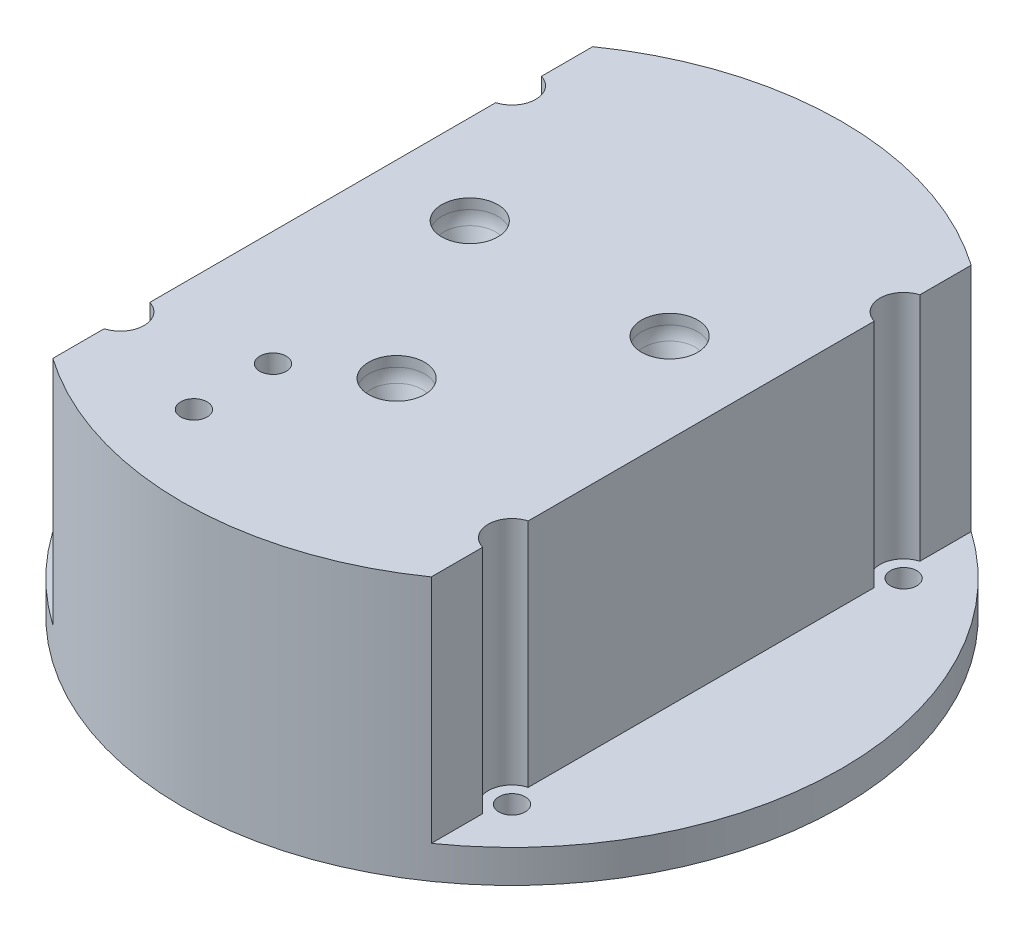
ISO-10303-21;
HEADER;
FILE_DESCRIPTION(('STEP AP214'),'2;1');
FILE_NAME('part.step','',(''),(''),'','','');
FILE_SCHEMA(('AUTOMOTIVE_DESIGN { 1 0 10303 214 1 1 1 1 }'));
ENDSEC;
DATA;
#1=APPLICATION_CONTEXT('core data for automotive mechanical design processes');
#2=APPLICATION_PROTOCOL_DEFINITION('international standard','automotive_design',2000,#1);
#3=PRODUCT_CONTEXT('',#1,'mechanical');
#4=PRODUCT('Part','Part','',(#3));
#5=PRODUCT_RELATED_PRODUCT_CATEGORY('part','',(#4));
#6=PRODUCT_DEFINITION_FORMATION('','',#4);
#7=PRODUCT_DEFINITION_CONTEXT('part definition',#1,'design');
#8=PRODUCT_DEFINITION('design','',#6,#7);
#9=PRODUCT_DEFINITION_SHAPE('','',#8);
#10=(LENGTH_UNIT() NAMED_UNIT(*) SI_UNIT(.MILLI.,.METRE.));
#11=(NAMED_UNIT(*) PLANE_ANGLE_UNIT() SI_UNIT($,.RADIAN.));
#12=(NAMED_UNIT(*) SI_UNIT($,.STERADIAN.) SOLID_ANGLE_UNIT());
#13=UNCERTAINTY_MEASURE_WITH_UNIT(LENGTH_MEASURE(1.E-05),#10,'distance_accuracy_value','');
#14=(GEOMETRIC_REPRESENTATION_CONTEXT(3) GLOBAL_UNCERTAINTY_ASSIGNED_CONTEXT((#13)) GLOBAL_UNIT_ASSIGNED_CONTEXT((#10,
#11,#12)) REPRESENTATION_CONTEXT('',''));
#15=CARTESIAN_POINT('',(0.,0.,0.));
#16=DIRECTION('',(0.,0.,1.));
#17=DIRECTION('',(1.,0.,0.));
#18=AXIS2_PLACEMENT_3D('',#15,#16,#17);
#19=CARTESIAN_POINT('',(-28.7,40.,0.));
#20=DIRECTION('',(1.,0.,0.));
#21=DIRECTION('',(0.,0.,-1.));
#22=AXIS2_PLACEMENT_3D('',#19,#20,#21);
#23=PLANE('',#22);
#24=DIRECTION('',(0.,-1.,0.));
#25=VECTOR('',#24,1.);
#26=CARTESIAN_POINT('',(-28.7,40.,-26.2397237477598));
#27=LINE('',#26,#25);
#28=CARTESIAN_POINT('',(-28.7,5.,-26.2397237477598));
#29=VERTEX_POINT('',#28);
#30=CARTESIAN_POINT('',(-28.7,40.,-26.2397237477598));
#31=VERTEX_POINT('',#30);
#32=EDGE_CURVE('E137',#29,#31,#27,.F.);
#33=ORIENTED_EDGE('',*,*,#32,.F.);
#34=DIRECTION('',(0.,0.,-1.));
#35=VECTOR('',#34,1.);
#36=CARTESIAN_POINT('',(-28.7,5.,0.));
#37=LINE('',#36,#35);
#38=CARTESIAN_POINT('',(-28.7,5.,26.2397237477595));
#39=VERTEX_POINT('',#38);
#40=EDGE_CURVE('E149',#39,#29,#37,.T.);
#41=ORIENTED_EDGE('',*,*,#40,.F.);
#42=DIRECTION('',(0.,-1.,0.));
#43=VECTOR('',#42,1.);
#44=CARTESIAN_POINT('',(-28.7,40.,26.2397237477595));
#45=LINE('',#44,#43);
#46=CARTESIAN_POINT('',(-28.7,40.,26.2397237477595));
#47=VERTEX_POINT('',#46);
#48=EDGE_CURVE('E232',#47,#39,#45,.T.);
#49=ORIENTED_EDGE('',*,*,#48,.F.);
#50=DIRECTION('',(0.,0.,1.));
#51=VECTOR('',#50,1.);
#52=CARTESIAN_POINT('',(-28.7,40.,0.));
#53=LINE('',#52,#51);
#54=EDGE_CURVE('E151',#31,#47,#53,.T.);
#55=ORIENTED_EDGE('',*,*,#54,.F.);
#56=EDGE_LOOP('',(#33,#41,#49,#55));
#57=FACE_BOUND('',#56,.T.);
#58=ADVANCED_FACE('F47',(#57),#23,.F.);
#59=DIRECTION('',(0.,-1.,0.));
#60=VECTOR('',#59,1.);
#61=CARTESIAN_POINT('',(-28.7,40.,33.1572458719102));
#62=LINE('',#61,#60);
#63=CARTESIAN_POINT('',(-28.7,5.,33.1572458719102));
#64=VERTEX_POINT('',#63);
#65=CARTESIAN_POINT('',(-28.7,40.,33.1572458719102));
#66=VERTEX_POINT('',#65);
#67=EDGE_CURVE('E301',#64,#66,#62,.F.);
#68=ORIENTED_EDGE('',*,*,#67,.F.);
#69=CARTESIAN_POINT('',(-28.7,5.,40.9427649286171));
#70=VERTEX_POINT('',#69);
#71=EDGE_CURVE('E158',#70,#64,#37,.T.);
#72=ORIENTED_EDGE('',*,*,#71,.F.);
#73=DIRECTION('',(0.,-1.,0.));
#74=VECTOR('',#73,1.);
#75=CARTESIAN_POINT('',(-28.7,40.,40.9427649286171));
#76=LINE('',#75,#74);
#77=CARTESIAN_POINT('',(-28.7,40.,40.9427649286171));
#78=VERTEX_POINT('',#77);
#79=EDGE_CURVE('E415',#78,#70,#76,.T.);
#80=ORIENTED_EDGE('',*,*,#79,.F.);
#81=EDGE_CURVE('E244',#66,#78,#53,.T.);
#82=ORIENTED_EDGE('',*,*,#81,.F.);
#83=EDGE_LOOP('',(#68,#72,#80,#82));
#84=FACE_BOUND('',#83,.T.);
#85=ADVANCED_FACE('F206',(#84),#23,.F.);
#86=CARTESIAN_POINT('',(28.7,40.,0.));
#87=DIRECTION('',(1.,0.,0.));
#88=DIRECTION('',(0.,0.,-1.));
#89=AXIS2_PLACEMENT_3D('',#86,#87,#88);
#90=PLANE('',#89);
#91=DIRECTION('',(0.,0.,-1.));
#92=VECTOR('',#91,1.);
#93=CARTESIAN_POINT('',(28.7,5.,0.));
#94=LINE('',#93,#92);
#95=CARTESIAN_POINT('',(28.7,5.,40.9427649286171));
#96=VERTEX_POINT('',#95);
#97=CARTESIAN_POINT('',(28.7,5.,33.1572458719104));
#98=VERTEX_POINT('',#97);
#99=EDGE_CURVE('E161',#96,#98,#94,.T.);
#100=ORIENTED_EDGE('',*,*,#99,.T.);
#101=DIRECTION('',(0.,-1.,0.));
#102=VECTOR('',#101,1.);
#103=CARTESIAN_POINT('',(28.7,40.,33.1572458719104));
#104=LINE('',#103,#102);
#105=CARTESIAN_POINT('',(28.7,40.,33.1572458719104));
#106=VERTEX_POINT('',#105);
#107=EDGE_CURVE('E303',#98,#106,#104,.F.);
#108=ORIENTED_EDGE('',*,*,#107,.T.);
#109=DIRECTION('',(0.,0.,1.));
#110=VECTOR('',#109,1.);
#111=CARTESIAN_POINT('',(28.7,40.,0.));
#112=LINE('',#111,#110);
#113=CARTESIAN_POINT('',(28.7,40.,40.9427649286171));
#114=VERTEX_POINT('',#113);
#115=EDGE_CURVE('E246',#106,#114,#112,.T.);
#116=ORIENTED_EDGE('',*,*,#115,.T.);
#117=DIRECTION('',(0.,-1.,0.));
#118=VECTOR('',#117,1.);
#119=CARTESIAN_POINT('',(28.7,40.,40.9427649286171));
#120=LINE('',#119,#118);
#121=EDGE_CURVE('E407',#114,#96,#120,.T.);
#122=ORIENTED_EDGE('',*,*,#121,.T.);
#123=EDGE_LOOP('',(#100,#108,#116,#122));
#124=FACE_BOUND('',#123,.T.);
#125=ADVANCED_FACE('F213',(#124),#90,.T.);
#126=CARTESIAN_POINT('',(28.7,5.,26.2397237477596));
#127=VERTEX_POINT('',#126);
#128=CARTESIAN_POINT('',(28.7,5.,-26.2397237477594));
#129=VERTEX_POINT('',#128);
#130=EDGE_CURVE('E410',#127,#129,#94,.T.);
#131=ORIENTED_EDGE('',*,*,#130,.T.);
#132=DIRECTION('',(0.,-1.,0.));
#133=VECTOR('',#132,1.);
#134=CARTESIAN_POINT('',(28.7,40.,-26.2397237477594));
#135=LINE('',#134,#133);
#136=CARTESIAN_POINT('',(28.7,40.,-26.2397237477594));
#137=VERTEX_POINT('',#136);
#138=EDGE_CURVE('E276',#129,#137,#135,.F.);
#139=ORIENTED_EDGE('',*,*,#138,.T.);
#140=CARTESIAN_POINT('',(28.7,40.,26.2397237477596));
#141=VERTEX_POINT('',#140);
#142=EDGE_CURVE('E424',#137,#141,#112,.T.);
#143=ORIENTED_EDGE('',*,*,#142,.T.);
#144=DIRECTION('',(0.,-1.,0.));
#145=VECTOR('',#144,1.);
#146=CARTESIAN_POINT('',(28.7,40.,26.2397237477596));
#147=LINE('',#146,#145);
#148=EDGE_CURVE('E306',#141,#127,#147,.T.);
#149=ORIENTED_EDGE('',*,*,#148,.T.);
#150=EDGE_LOOP('',(#131,#139,#143,#149));
#151=FACE_BOUND('',#150,.T.);
#152=ADVANCED_FACE('F219',(#151),#90,.T.);
#153=DIRECTION('',(0.,-1.,0.));
#154=VECTOR('',#153,1.);
#155=CARTESIAN_POINT('',(-28.7,40.,-33.1572458719106));
#156=LINE('',#155,#154);
#157=CARTESIAN_POINT('',(-28.7,40.,-33.1572458719106));
#158=VERTEX_POINT('',#157);
#159=CARTESIAN_POINT('',(-28.7,5.,-33.1572458719106));
#160=VERTEX_POINT('',#159);
#161=EDGE_CURVE('E140',#158,#160,#156,.T.);
#162=ORIENTED_EDGE('',*,*,#161,.F.);
#163=CARTESIAN_POINT('',(-28.7,40.,-40.9427649286171));
#164=VERTEX_POINT('',#163);
#165=EDGE_CURVE('E230',#164,#158,#53,.T.);
#166=ORIENTED_EDGE('',*,*,#165,.F.);
#167=DIRECTION('',(0.,-1.,0.));
#168=VECTOR('',#167,1.);
#169=CARTESIAN_POINT('',(-28.7,40.,-40.9427649286171));
#170=LINE('',#169,#168);
#171=CARTESIAN_POINT('',(-28.7,5.,-40.9427649286171));
#172=VERTEX_POINT('',#171);
#173=EDGE_CURVE('E413',#164,#172,#170,.T.);
#174=ORIENTED_EDGE('',*,*,#173,.T.);
#175=EDGE_CURVE('E67',#160,#172,#37,.T.);
#176=ORIENTED_EDGE('',*,*,#175,.F.);
#177=EDGE_LOOP('',(#162,#166,#174,#176));
#178=FACE_BOUND('',#177,.T.);
#179=ADVANCED_FACE('F208',(#178),#23,.F.);
#180=CARTESIAN_POINT('',(28.7,40.,-40.9427649286171));
#181=VERTEX_POINT('',#180);
#182=CARTESIAN_POINT('',(28.7,40.,-33.15724587191));
#183=VERTEX_POINT('',#182);
#184=EDGE_CURVE('E422',#181,#183,#112,.T.);
#185=ORIENTED_EDGE('',*,*,#184,.T.);
#186=DIRECTION('',(0.,-1.,0.));
#187=VECTOR('',#186,1.);
#188=CARTESIAN_POINT('',(28.7,40.,-33.15724587191));
#189=LINE('',#188,#187);
#190=CARTESIAN_POINT('',(28.7,5.,-33.15724587191));
#191=VERTEX_POINT('',#190);
#192=EDGE_CURVE('E152',#183,#191,#189,.T.);
#193=ORIENTED_EDGE('',*,*,#192,.T.);
#194=CARTESIAN_POINT('',(28.7,5.,-40.9427649286171));
#195=VERTEX_POINT('',#194);
#196=EDGE_CURVE('E411',#191,#195,#94,.T.);
#197=ORIENTED_EDGE('',*,*,#196,.T.);
#198=DIRECTION('',(0.,-1.,0.));
#199=VECTOR('',#198,1.);
#200=CARTESIAN_POINT('',(28.7,40.,-40.9427649286171));
#201=LINE('',#200,#199);
#202=EDGE_CURVE('E420',#181,#195,#201,.T.);
#203=ORIENTED_EDGE('',*,*,#202,.F.);
#204=EDGE_LOOP('',(#185,#193,#197,#203));
#205=FACE_BOUND('',#204,.T.);
#206=ADVANCED_FACE('F218',(#205),#90,.T.);
#207=CARTESIAN_POINT('',(29.698484809835,5.,29.698484809835));
#208=DIRECTION('',(0.,-1.,0.));
#209=DIRECTION('',(0.,0.,-1.));
#210=AXIS2_PLACEMENT_3D('',#207,#208,#209);
#211=CYLINDRICAL_SURFACE('',#210,2.00000000000001);
#212=CARTESIAN_POINT('',(29.698484809835,0.,29.698484809835));
#213=DIRECTION('',(0.,-1.,0.));
#214=DIRECTION('',(0.,0.,-1.));
#215=AXIS2_PLACEMENT_3D('',#212,#213,#214);
#216=CIRCLE('',#215,2.00000000000001);
#217=CARTESIAN_POINT('',(29.698484809835,0.,27.698484809835));
#218=VERTEX_POINT('',#217);
#219=EDGE_CURVE('E269',#218,#218,#216,.T.);
#220=ORIENTED_EDGE('',*,*,#219,.T.);
#221=EDGE_LOOP('',(#220));
#222=FACE_BOUND('',#221,.T.);
#223=CARTESIAN_POINT('',(29.698484809835,5.,29.698484809835));
#224=DIRECTION('',(0.,-1.,0.));
#225=DIRECTION('',(0.,0.,-1.));
#226=AXIS2_PLACEMENT_3D('',#223,#224,#225);
#227=CIRCLE('',#226,2.00000000000001);
#228=CARTESIAN_POINT('',(29.698484809835,5.,27.698484809835));
#229=VERTEX_POINT('',#228);
#230=EDGE_CURVE('E291',#229,#229,#227,.T.);
#231=ORIENTED_EDGE('',*,*,#230,.F.);
#232=EDGE_LOOP('',(#231));
#233=FACE_BOUND('',#232,.T.);
#234=ADVANCED_FACE('F225',(#222,#233),#211,.F.);
#235=CARTESIAN_POINT('',(29.698484809835,5.,-29.698484809835));
#236=DIRECTION('',(0.,-1.,0.));
#237=DIRECTION('',(0.,0.,-1.));
#238=AXIS2_PLACEMENT_3D('',#235,#236,#237);
#239=CYLINDRICAL_SURFACE('',#238,2.00000000000001);
#240=CARTESIAN_POINT('',(29.698484809835,0.,-29.698484809835));
#241=DIRECTION('',(0.,-1.,0.));
#242=DIRECTION('',(0.,0.,-1.));
#243=AXIS2_PLACEMENT_3D('',#240,#241,#242);
#244=CIRCLE('',#243,2.00000000000001);
#245=CARTESIAN_POINT('',(29.698484809835,0.,-31.698484809835));
#246=VERTEX_POINT('',#245);
#247=EDGE_CURVE('E288',#246,#246,#244,.T.);
#248=ORIENTED_EDGE('',*,*,#247,.T.);
#249=EDGE_LOOP('',(#248));
#250=FACE_BOUND('',#249,.T.);
#251=CARTESIAN_POINT('',(29.698484809835,5.,-29.698484809835));
#252=DIRECTION('',(0.,-1.,0.));
#253=DIRECTION('',(0.,0.,-1.));
#254=AXIS2_PLACEMENT_3D('',#251,#252,#253);
#255=CIRCLE('',#254,2.00000000000001);
#256=CARTESIAN_POINT('',(29.698484809835,5.,-31.698484809835));
#257=VERTEX_POINT('',#256);
#258=EDGE_CURVE('E285',#257,#257,#255,.T.);
#259=ORIENTED_EDGE('',*,*,#258,.F.);
#260=EDGE_LOOP('',(#259));
#261=FACE_BOUND('',#260,.T.);
#262=ADVANCED_FACE('F373',(#250,#261),#239,.F.);
#263=CARTESIAN_POINT('',(-29.698484809835,5.,29.698484809835));
#264=DIRECTION('',(0.,-1.,0.));
#265=DIRECTION('',(0.,0.,-1.));
#266=AXIS2_PLACEMENT_3D('',#263,#264,#265);
#267=CYLINDRICAL_SURFACE('',#266,2.00000000000001);
#268=CARTESIAN_POINT('',(-29.698484809835,0.,29.698484809835));
#269=DIRECTION('',(0.,-1.,0.));
#270=DIRECTION('',(0.,0.,-1.));
#271=AXIS2_PLACEMENT_3D('',#268,#269,#270);
#272=CIRCLE('',#271,2.00000000000001);
#273=CARTESIAN_POINT('',(-29.698484809835,0.,27.698484809835));
#274=VERTEX_POINT('',#273);
#275=EDGE_CURVE('E266',#274,#274,#272,.T.);
#276=ORIENTED_EDGE('',*,*,#275,.T.);
#277=EDGE_LOOP('',(#276));
#278=FACE_BOUND('',#277,.T.);
#279=CARTESIAN_POINT('',(-29.698484809835,5.,29.698484809835));
#280=DIRECTION('',(0.,-1.,0.));
#281=DIRECTION('',(0.,0.,-1.));
#282=AXIS2_PLACEMENT_3D('',#279,#280,#281);
#283=CIRCLE('',#282,2.00000000000001);
#284=CARTESIAN_POINT('',(-29.698484809835,5.,27.698484809835));
#285=VERTEX_POINT('',#284);
#286=EDGE_CURVE('E261',#285,#285,#283,.T.);
#287=ORIENTED_EDGE('',*,*,#286,.F.);
#288=EDGE_LOOP('',(#287));
#289=FACE_BOUND('',#288,.T.);
#290=ADVANCED_FACE('F377',(#278,#289),#267,.F.);
#291=CARTESIAN_POINT('',(-29.698484809835,5.,-29.698484809835));
#292=DIRECTION('',(0.,-1.,0.));
#293=DIRECTION('',(0.,0.,-1.));
#294=AXIS2_PLACEMENT_3D('',#291,#292,#293);
#295=CYLINDRICAL_SURFACE('',#294,2.00000000000001);
#296=CARTESIAN_POINT('',(-29.698484809835,0.,-29.698484809835));
#297=DIRECTION('',(0.,-1.,0.));
#298=DIRECTION('',(0.,0.,-1.));
#299=AXIS2_PLACEMENT_3D('',#296,#297,#298);
#300=CIRCLE('',#299,2.00000000000001);
#301=CARTESIAN_POINT('',(-29.698484809835,0.,-31.698484809835));
#302=VERTEX_POINT('',#301);
#303=EDGE_CURVE('E282',#302,#302,#300,.T.);
#304=ORIENTED_EDGE('',*,*,#303,.T.);
#305=EDGE_LOOP('',(#304));
#306=FACE_BOUND('',#305,.T.);
#307=CARTESIAN_POINT('',(-29.698484809835,5.,-29.698484809835));
#308=DIRECTION('',(0.,-1.,0.));
#309=DIRECTION('',(0.,0.,-1.));
#310=AXIS2_PLACEMENT_3D('',#307,#308,#309);
#311=CIRCLE('',#310,2.00000000000001);
#312=CARTESIAN_POINT('',(-29.698484809835,5.,-31.698484809835));
#313=VERTEX_POINT('',#312);
#314=EDGE_CURVE('E279',#313,#313,#311,.T.);
#315=ORIENTED_EDGE('',*,*,#314,.F.);
#316=EDGE_LOOP('',(#315));
#317=FACE_BOUND('',#316,.T.);
#318=ADVANCED_FACE('F379',(#306,#317),#295,.F.);
#319=CARTESIAN_POINT('',(0.,5.,0.));
#320=DIRECTION('',(0.,1.,0.));
#321=DIRECTION('',(0.,0.,1.));
#322=AXIS2_PLACEMENT_3D('',#319,#320,#321);
#323=PLANE('',#322);
#324=ORIENTED_EDGE('',*,*,#40,.T.);
#325=CARTESIAN_POINT('',(-29.6984848098348,5.,-29.6984848098352));
#326=DIRECTION('',(0.,1.,0.));
#327=DIRECTION('',(0.,0.,1.));
#328=AXIS2_PLACEMENT_3D('',#325,#326,#327);
#329=CIRCLE('',#328,3.6);
#330=EDGE_CURVE('E134',#29,#160,#329,.T.);
#331=ORIENTED_EDGE('',*,*,#330,.T.);
#332=ORIENTED_EDGE('',*,*,#175,.T.);
#333=CARTESIAN_POINT('',(0.,5.,0.));
#334=DIRECTION('',(0.,1.,0.));
#335=DIRECTION('',(0.,0.,1.));
#336=AXIS2_PLACEMENT_3D('',#333,#334,#335);
#337=CIRCLE('',#336,50.);
#338=EDGE_CURVE('E62',#172,#70,#337,.T.);
#339=ORIENTED_EDGE('',*,*,#338,.T.);
#340=ORIENTED_EDGE('',*,*,#71,.T.);
#341=CARTESIAN_POINT('',(-29.6984848098351,5.,29.6984848098349));
#342=DIRECTION('',(0.,1.,0.));
#343=DIRECTION('',(0.,0.,1.));
#344=AXIS2_PLACEMENT_3D('',#341,#342,#343);
#345=CIRCLE('',#344,3.60000000000001);
#346=EDGE_CURVE('E157',#64,#39,#345,.T.);
#347=ORIENTED_EDGE('',*,*,#346,.T.);
#348=EDGE_LOOP('',(#324,#331,#332,#339,#340,#347));
#349=FACE_BOUND('',#348,.T.);
#350=ORIENTED_EDGE('',*,*,#314,.T.);
#351=EDGE_LOOP('',(#350));
#352=FACE_BOUND('',#351,.T.);
#353=ORIENTED_EDGE('',*,*,#286,.T.);
#354=EDGE_LOOP('',(#353));
#355=FACE_BOUND('',#354,.T.);
#356=ADVANCED_FACE('F155',(#349,#352,#355),#323,.T.);
#357=CARTESIAN_POINT('',(0.,5.,0.));
#358=DIRECTION('',(0.,-1.,0.));
#359=DIRECTION('',(0.,0.,-1.));
#360=AXIS2_PLACEMENT_3D('',#357,#358,#359);
#361=CYLINDRICAL_SURFACE('',#360,50.);
#362=CARTESIAN_POINT('',(0.,0.,0.));
#363=DIRECTION('',(0.,1.,0.));
#364=DIRECTION('',(0.,0.,1.));
#365=AXIS2_PLACEMENT_3D('',#362,#363,#364);
#366=CIRCLE('',#365,50.);
#367=CARTESIAN_POINT('',(0.,0.,50.));
#368=VERTEX_POINT('',#367);
#369=EDGE_CURVE('E160',#368,#368,#366,.T.);
#370=ORIENTED_EDGE('',*,*,#369,.T.);
#371=EDGE_LOOP('',(#370));
#372=FACE_BOUND('',#371,.T.);
#373=EDGE_CURVE('E165',#96,#195,#337,.T.);
#374=ORIENTED_EDGE('',*,*,#373,.F.);
#375=ORIENTED_EDGE('',*,*,#121,.F.);
#376=CARTESIAN_POINT('',(0.,40.,0.));
#377=DIRECTION('',(0.,1.,0.));
#378=DIRECTION('',(0.,0.,1.));
#379=AXIS2_PLACEMENT_3D('',#376,#377,#378);
#380=CIRCLE('',#379,50.);
#381=EDGE_CURVE('E242',#78,#114,#380,.T.);
#382=ORIENTED_EDGE('',*,*,#381,.F.);
#383=ORIENTED_EDGE('',*,*,#79,.T.);
#384=ORIENTED_EDGE('',*,*,#338,.F.);
#385=ORIENTED_EDGE('',*,*,#173,.F.);
#386=EDGE_CURVE('E240',#181,#164,#380,.T.);
#387=ORIENTED_EDGE('',*,*,#386,.F.);
#388=ORIENTED_EDGE('',*,*,#202,.T.);
#389=EDGE_LOOP('',(#374,#375,#382,#383,#384,#385,#387,#388));
#390=FACE_BOUND('',#389,.T.);
#391=ADVANCED_FACE('F429',(#372,#390),#361,.T.);
#392=CARTESIAN_POINT('',(29.698484809835,5.,29.698484809835));
#393=DIRECTION('',(0.,1.,0.));
#394=DIRECTION('',(0.,0.,1.));
#395=AXIS2_PLACEMENT_3D('',#392,#393,#394);
#396=CIRCLE('',#395,3.6);
#397=EDGE_CURVE('E310',#127,#98,#396,.T.);
#398=ORIENTED_EDGE('',*,*,#397,.T.);
#399=ORIENTED_EDGE('',*,*,#99,.F.);
#400=ORIENTED_EDGE('',*,*,#373,.T.);
#401=ORIENTED_EDGE('',*,*,#196,.F.);
#402=CARTESIAN_POINT('',(29.6984848098353,5.,-29.6984848098347));
#403=DIRECTION('',(0.,1.,0.));
#404=DIRECTION('',(0.,0.,1.));
#405=AXIS2_PLACEMENT_3D('',#402,#403,#404);
#406=CIRCLE('',#405,3.60000000000002);
#407=EDGE_CURVE('E316',#191,#129,#406,.T.);
#408=ORIENTED_EDGE('',*,*,#407,.T.);
#409=ORIENTED_EDGE('',*,*,#130,.F.);
#410=EDGE_LOOP('',(#398,#399,#400,#401,#408,#409));
#411=FACE_BOUND('',#410,.T.);
#412=ORIENTED_EDGE('',*,*,#230,.T.);
#413=EDGE_LOOP('',(#412));
#414=FACE_BOUND('',#413,.T.);
#415=ORIENTED_EDGE('',*,*,#258,.T.);
#416=EDGE_LOOP('',(#415));
#417=FACE_BOUND('',#416,.T.);
#418=ADVANCED_FACE('F430',(#411,#414,#417),#323,.T.);
#419=CARTESIAN_POINT('',(0.,0.,0.));
#420=DIRECTION('',(0.,1.,0.));
#421=DIRECTION('',(0.,0.,1.));
#422=AXIS2_PLACEMENT_3D('',#419,#420,#421);
#423=PLANE('',#422);
#424=CARTESIAN_POINT('',(0.,0.,0.));
#425=DIRECTION('',(0.,-1.,0.));
#426=DIRECTION('',(0.,0.,-1.));
#427=AXIS2_PLACEMENT_3D('',#424,#425,#426);
#428=CIRCLE('',#427,5.05);
#429=CARTESIAN_POINT('',(0.,0.,-5.05));
#430=VERTEX_POINT('',#429);
#431=EDGE_CURVE('E275',#430,#430,#428,.T.);
#432=ORIENTED_EDGE('',*,*,#431,.F.);
#433=EDGE_LOOP('',(#432));
#434=FACE_BOUND('',#433,.T.);
#435=ORIENTED_EDGE('',*,*,#303,.F.);
#436=EDGE_LOOP('',(#435));
#437=FACE_BOUND('',#436,.T.);
#438=ORIENTED_EDGE('',*,*,#247,.F.);
#439=EDGE_LOOP('',(#438));
#440=FACE_BOUND('',#439,.T.);
#441=ORIENTED_EDGE('',*,*,#219,.F.);
#442=EDGE_LOOP('',(#441));
#443=FACE_BOUND('',#442,.T.);
#444=ORIENTED_EDGE('',*,*,#275,.F.);
#445=EDGE_LOOP('',(#444));
#446=FACE_BOUND('',#445,.T.);
#447=CARTESIAN_POINT('',(-11.3,0.,24.9427649286171));
#448=DIRECTION('',(0.,1.,0.));
#449=DIRECTION('',(0.,0.,1.));
#450=AXIS2_PLACEMENT_3D('',#447,#448,#449);
#451=CIRCLE('',#450,2.);
#452=CARTESIAN_POINT('',(-11.3,0.,26.9427649286171));
#453=VERTEX_POINT('',#452);
#454=EDGE_CURVE('E252',#453,#453,#451,.T.);
#455=ORIENTED_EDGE('',*,*,#454,.T.);
#456=EDGE_LOOP('',(#455));
#457=FACE_BOUND('',#456,.T.);
#458=CARTESIAN_POINT('',(-11.3,0.,36.9427649286171));
#459=DIRECTION('',(0.,1.,0.));
#460=DIRECTION('',(0.,0.,-1.));
#461=AXIS2_PLACEMENT_3D('',#458,#459,#460);
#462=CIRCLE('',#461,2.);
#463=CARTESIAN_POINT('',(-11.3,0.,34.9427649286171));
#464=VERTEX_POINT('',#463);
#465=EDGE_CURVE('E257',#464,#464,#462,.T.);
#466=ORIENTED_EDGE('',*,*,#465,.T.);
#467=EDGE_LOOP('',(#466));
#468=FACE_BOUND('',#467,.T.);
#469=ORIENTED_EDGE('',*,*,#369,.F.);
#470=EDGE_LOOP('',(#469));
#471=FACE_BOUND('',#470,.T.);
#472=ADVANCED_FACE('F337',(#434,#437,#440,#443,#446,#457,#468,#471),#423,.F.);
#473=CARTESIAN_POINT('',(0.,40.,0.));
#474=DIRECTION('',(0.,1.,0.));
#475=DIRECTION('',(0.,0.,1.));
#476=AXIS2_PLACEMENT_3D('',#473,#474,#475);
#477=PLANE('',#476);
#478=CARTESIAN_POINT('',(-15.1554445662276,40.,-8.75000000000007));
#479=DIRECTION('',(0.,1.,0.));
#480=DIRECTION('',(-0.866025403784436,0.,-0.500000000000004));
#481=AXIS2_PLACEMENT_3D('',#478,#479,#480);
#482=CIRCLE('',#481,4.25);
#483=CARTESIAN_POINT('',(-18.8360525323115,40.,-10.8750000000001));
#484=VERTEX_POINT('',#483);
#485=EDGE_CURVE('E325',#484,#484,#482,.T.);
#486=ORIENTED_EDGE('',*,*,#485,.F.);
#487=EDGE_LOOP('',(#486));
#488=FACE_BOUND('',#487,.T.);
#489=CARTESIAN_POINT('',(15.1554445662278,40.,-8.74999999999986));
#490=DIRECTION('',(0.,1.,0.));
#491=DIRECTION('',(0.866025403784443,0.,-0.499999999999992));
#492=AXIS2_PLACEMENT_3D('',#489,#490,#491);
#493=CIRCLE('',#492,4.25);
#494=CARTESIAN_POINT('',(18.8360525323116,40.,-10.8749999999998));
#495=VERTEX_POINT('',#494);
#496=EDGE_CURVE('E326',#495,#495,#493,.T.);
#497=ORIENTED_EDGE('',*,*,#496,.F.);
#498=EDGE_LOOP('',(#497));
#499=FACE_BOUND('',#498,.T.);
#500=CARTESIAN_POINT('',(0.,40.,17.5));
#501=DIRECTION('',(0.,1.,0.));
#502=DIRECTION('',(0.,0.,1.));
#503=AXIS2_PLACEMENT_3D('',#500,#501,#502);
#504=CIRCLE('',#503,4.25);
#505=CARTESIAN_POINT('',(0.,40.,21.75));
#506=VERTEX_POINT('',#505);
#507=EDGE_CURVE('E317',#506,#506,#504,.T.);
#508=ORIENTED_EDGE('',*,*,#507,.F.);
#509=EDGE_LOOP('',(#508));
#510=FACE_BOUND('',#509,.T.);
#511=ORIENTED_EDGE('',*,*,#142,.F.);
#512=CARTESIAN_POINT('',(29.6984848098353,40.,-29.6984848098347));
#513=DIRECTION('',(0.,1.,0.));
#514=DIRECTION('',(0.,0.,1.));
#515=AXIS2_PLACEMENT_3D('',#512,#513,#514);
#516=CIRCLE('',#515,3.60000000000002);
#517=EDGE_CURVE('E314',#183,#137,#516,.T.);
#518=ORIENTED_EDGE('',*,*,#517,.F.);
#519=ORIENTED_EDGE('',*,*,#184,.F.);
#520=ORIENTED_EDGE('',*,*,#386,.T.);
#521=ORIENTED_EDGE('',*,*,#165,.T.);
#522=CARTESIAN_POINT('',(-29.6984848098348,40.,-29.6984848098352));
#523=DIRECTION('',(0.,1.,0.));
#524=DIRECTION('',(0.,0.,1.));
#525=AXIS2_PLACEMENT_3D('',#522,#523,#524);
#526=CIRCLE('',#525,3.6);
#527=EDGE_CURVE('E143',#31,#158,#526,.T.);
#528=ORIENTED_EDGE('',*,*,#527,.F.);
#529=ORIENTED_EDGE('',*,*,#54,.T.);
#530=CARTESIAN_POINT('',(-29.6984848098351,40.,29.6984848098349));
#531=DIRECTION('',(0.,1.,0.));
#532=DIRECTION('',(0.,0.,1.));
#533=AXIS2_PLACEMENT_3D('',#530,#531,#532);
#534=CIRCLE('',#533,3.60000000000001);
#535=EDGE_CURVE('E142',#66,#47,#534,.T.);
#536=ORIENTED_EDGE('',*,*,#535,.F.);
#537=ORIENTED_EDGE('',*,*,#81,.T.);
#538=ORIENTED_EDGE('',*,*,#381,.T.);
#539=ORIENTED_EDGE('',*,*,#115,.F.);
#540=CARTESIAN_POINT('',(29.698484809835,40.,29.698484809835));
#541=DIRECTION('',(0.,1.,0.));
#542=DIRECTION('',(0.,0.,1.));
#543=AXIS2_PLACEMENT_3D('',#540,#541,#542);
#544=CIRCLE('',#543,3.6);
#545=EDGE_CURVE('E309',#141,#106,#544,.T.);
#546=ORIENTED_EDGE('',*,*,#545,.F.);
#547=EDGE_LOOP('',(#511,#518,#519,#520,#521,#528,#529,#536,#537,#538,#539,#546));
#548=FACE_BOUND('',#547,.T.);
#549=CARTESIAN_POINT('',(-11.3,40.,24.9427649286171));
#550=DIRECTION('',(0.,1.,0.));
#551=DIRECTION('',(0.,0.,1.));
#552=AXIS2_PLACEMENT_3D('',#549,#550,#551);
#553=CIRCLE('',#552,2.);
#554=CARTESIAN_POINT('',(-11.3,40.,26.9427649286171));
#555=VERTEX_POINT('',#554);
#556=EDGE_CURVE('E254',#555,#555,#553,.T.);
#557=ORIENTED_EDGE('',*,*,#556,.F.);
#558=EDGE_LOOP('',(#557));
#559=FACE_BOUND('',#558,.T.);
#560=CARTESIAN_POINT('',(-11.3,40.,36.9427649286171));
#561=DIRECTION('',(0.,1.,0.));
#562=DIRECTION('',(0.,0.,-1.));
#563=AXIS2_PLACEMENT_3D('',#560,#561,#562);
#564=CIRCLE('',#563,2.);
#565=CARTESIAN_POINT('',(-11.3,40.,34.9427649286171));
#566=VERTEX_POINT('',#565);
#567=EDGE_CURVE('E260',#566,#566,#564,.T.);
#568=ORIENTED_EDGE('',*,*,#567,.F.);
#569=EDGE_LOOP('',(#568));
#570=FACE_BOUND('',#569,.T.);
#571=ADVANCED_FACE('F236',(#488,#499,#510,#548,#559,#570),#477,.T.);
#572=CARTESIAN_POINT('',(-11.3,0.,36.9427649286171));
#573=DIRECTION('',(0.,1.,0.));
#574=DIRECTION('',(0.,0.,1.));
#575=AXIS2_PLACEMENT_3D('',#572,#573,#574);
#576=CYLINDRICAL_SURFACE('',#575,2.);
#577=ORIENTED_EDGE('',*,*,#465,.F.);
#578=EDGE_LOOP('',(#577));
#579=FACE_BOUND('',#578,.T.);
#580=ORIENTED_EDGE('',*,*,#567,.T.);
#581=EDGE_LOOP('',(#580));
#582=FACE_BOUND('',#581,.T.);
#583=ADVANCED_FACE('F336',(#579,#582),#576,.F.);
#584=CARTESIAN_POINT('',(-11.3,0.,24.9427649286171));
#585=DIRECTION('',(0.,1.,0.));
#586=DIRECTION('',(0.,0.,1.));
#587=AXIS2_PLACEMENT_3D('',#584,#585,#586);
#588=CYLINDRICAL_SURFACE('',#587,2.);
#589=ORIENTED_EDGE('',*,*,#454,.F.);
#590=EDGE_LOOP('',(#589));
#591=FACE_BOUND('',#590,.T.);
#592=ORIENTED_EDGE('',*,*,#556,.T.);
#593=EDGE_LOOP('',(#592));
#594=FACE_BOUND('',#593,.T.);
#595=ADVANCED_FACE('F386',(#591,#594),#588,.F.);
#596=CARTESIAN_POINT('',(0.,5.,0.));
#597=DIRECTION('',(0.,-1.,0.));
#598=DIRECTION('',(0.,0.,-1.));
#599=AXIS2_PLACEMENT_3D('',#596,#597,#598);
#600=CYLINDRICAL_SURFACE('',#599,5.05);
#601=CARTESIAN_POINT('',(0.,5.,0.));
#602=DIRECTION('',(0.,-1.,0.));
#603=DIRECTION('',(0.,0.,-1.));
#604=AXIS2_PLACEMENT_3D('',#601,#602,#603);
#605=CIRCLE('',#604,5.05);
#606=CARTESIAN_POINT('',(0.,5.,-5.05));
#607=VERTEX_POINT('',#606);
#608=EDGE_CURVE('E272',#607,#607,#605,.T.);
#609=ORIENTED_EDGE('',*,*,#608,.F.);
#610=EDGE_LOOP('',(#609));
#611=FACE_BOUND('',#610,.T.);
#612=ORIENTED_EDGE('',*,*,#431,.T.);
#613=EDGE_LOOP('',(#612));
#614=FACE_BOUND('',#613,.T.);
#615=ADVANCED_FACE('F383',(#611,#614),#600,.F.);
#616=CARTESIAN_POINT('',(0.,5.,0.));
#617=DIRECTION('',(0.,-1.,0.));
#618=DIRECTION('',(0.,0.,-1.));
#619=AXIS2_PLACEMENT_3D('',#616,#617,#618);
#620=PLANE('',#619);
#621=ORIENTED_EDGE('',*,*,#608,.T.);
#622=EDGE_LOOP('',(#621));
#623=FACE_BOUND('',#622,.T.);
#624=ADVANCED_FACE('F367',(#623),#620,.T.);
#625=CARTESIAN_POINT('',(-29.6984848098348,40.,-29.6984848098352));
#626=DIRECTION('',(0.,-1.,0.));
#627=DIRECTION('',(0.,0.,-1.));
#628=AXIS2_PLACEMENT_3D('',#625,#626,#627);
#629=CYLINDRICAL_SURFACE('',#628,3.6);
#630=ORIENTED_EDGE('',*,*,#32,.T.);
#631=ORIENTED_EDGE('',*,*,#527,.T.);
#632=ORIENTED_EDGE('',*,*,#161,.T.);
#633=ORIENTED_EDGE('',*,*,#330,.F.);
#634=EDGE_LOOP('',(#630,#631,#632,#633));
#635=FACE_BOUND('',#634,.T.);
#636=ADVANCED_FACE('F136',(#635),#629,.F.);
#637=CARTESIAN_POINT('',(-29.6984848098351,40.,29.6984848098349));
#638=DIRECTION('',(0.,-1.,0.));
#639=DIRECTION('',(0.,0.,-1.));
#640=AXIS2_PLACEMENT_3D('',#637,#638,#639);
#641=CYLINDRICAL_SURFACE('',#640,3.60000000000001);
#642=ORIENTED_EDGE('',*,*,#48,.T.);
#643=ORIENTED_EDGE('',*,*,#346,.F.);
#644=ORIENTED_EDGE('',*,*,#67,.T.);
#645=ORIENTED_EDGE('',*,*,#535,.T.);
#646=EDGE_LOOP('',(#642,#643,#644,#645));
#647=FACE_BOUND('',#646,.T.);
#648=ADVANCED_FACE('F361',(#647),#641,.F.);
#649=CARTESIAN_POINT('',(29.6984848098353,40.,-29.6984848098347));
#650=DIRECTION('',(0.,-1.,0.));
#651=DIRECTION('',(0.,0.,-1.));
#652=AXIS2_PLACEMENT_3D('',#649,#650,#651);
#653=CYLINDRICAL_SURFACE('',#652,3.60000000000002);
#654=ORIENTED_EDGE('',*,*,#407,.F.);
#655=ORIENTED_EDGE('',*,*,#192,.F.);
#656=ORIENTED_EDGE('',*,*,#517,.T.);
#657=ORIENTED_EDGE('',*,*,#138,.F.);
#658=EDGE_LOOP('',(#654,#655,#656,#657));
#659=FACE_BOUND('',#658,.T.);
#660=ADVANCED_FACE('F356',(#659),#653,.F.);
#661=CARTESIAN_POINT('',(29.698484809835,40.,29.698484809835));
#662=DIRECTION('',(0.,-1.,0.));
#663=DIRECTION('',(0.,0.,-1.));
#664=AXIS2_PLACEMENT_3D('',#661,#662,#663);
#665=CYLINDRICAL_SURFACE('',#664,3.6);
#666=ORIENTED_EDGE('',*,*,#397,.F.);
#667=ORIENTED_EDGE('',*,*,#148,.F.);
#668=ORIENTED_EDGE('',*,*,#545,.T.);
#669=ORIENTED_EDGE('',*,*,#107,.F.);
#670=EDGE_LOOP('',(#666,#667,#668,#669));
#671=FACE_BOUND('',#670,.T.);
#672=ADVANCED_FACE('F346',(#671),#665,.F.);
#673=CARTESIAN_POINT('',(0.,32.5,17.5));
#674=DIRECTION('',(0.,1.,0.));
#675=DIRECTION('',(0.,0.,1.));
#676=AXIS2_PLACEMENT_3D('',#673,#674,#675);
#677=CYLINDRICAL_SURFACE('',#676,4.25);
#678=CARTESIAN_POINT('',(0.,38.4629120178363,17.5));
#679=DIRECTION('',(0.,-1.,0.));
#680=DIRECTION('',(0.,0.,-1.));
#681=AXIS2_PLACEMENT_3D('',#678,#679,#680);
#682=CIRCLE('',#681,4.25);
#683=CARTESIAN_POINT('',(0.,38.4629120178363,13.25));
#684=VERTEX_POINT('',#683);
#685=EDGE_CURVE('E173',#684,#684,#682,.T.);
#686=ORIENTED_EDGE('',*,*,#685,.T.);
#687=EDGE_LOOP('',(#686));
#688=FACE_BOUND('',#687,.T.);
#689=ORIENTED_EDGE('',*,*,#507,.T.);
#690=EDGE_LOOP('',(#689));
#691=FACE_BOUND('',#690,.T.);
#692=ADVANCED_FACE('F343',(#688,#691),#677,.F.);
#693=CARTESIAN_POINT('',(0.,32.5,17.5));
#694=DIRECTION('',(0.,1.,0.));
#695=DIRECTION('',(0.,0.,1.));
#696=AXIS2_PLACEMENT_3D('',#693,#694,#695);
#697=PLANE('',#696);
#698=CARTESIAN_POINT('',(0.,32.5,17.5));
#699=DIRECTION('',(0.,1.,0.));
#700=DIRECTION('',(0.,0.,1.));
#701=AXIS2_PLACEMENT_3D('',#698,#699,#700);
#702=CIRCLE('',#701,2.24999999999997);
#703=CARTESIAN_POINT('',(0.,32.5,19.75));
#704=VERTEX_POINT('',#703);
#705=EDGE_CURVE('E168',#704,#704,#702,.T.);
#706=ORIENTED_EDGE('',*,*,#705,.T.);
#707=EDGE_LOOP('',(#706));
#708=FACE_BOUND('',#707,.T.);
#709=ADVANCED_FACE('F345',(#708),#697,.T.);
#710=CARTESIAN_POINT('',(0.,32.5,17.5));
#711=DIRECTION('',(0.,1.,0.));
#712=DIRECTION('',(0.,0.,1.));
#713=AXIS2_PLACEMENT_3D('',#710,#711,#712);
#714=CONICAL_SURFACE('',#713,2.24999999999997,0.380506377112366);
#715=CARTESIAN_POINT('',(0.,36.6059586360658,17.5));
#716=DIRECTION('',(0.,1.,0.));
#717=DIRECTION('',(0.,0.,1.));
#718=AXIS2_PLACEMENT_3D('',#715,#716,#717);
#719=CIRCLE('',#718,3.8923834544263);
#720=CARTESIAN_POINT('',(0.,36.6059586360658,21.3923834544263));
#721=VERTEX_POINT('',#720);
#722=EDGE_CURVE('E176',#721,#721,#719,.T.);
#723=ORIENTED_EDGE('',*,*,#722,.T.);
#724=EDGE_LOOP('',(#723));
#725=FACE_BOUND('',#724,.T.);
#726=ORIENTED_EDGE('',*,*,#705,.F.);
#727=EDGE_LOOP('',(#726));
#728=FACE_BOUND('',#727,.T.);
#729=ADVANCED_FACE('F353',(#725,#728),#714,.F.);
#730=CARTESIAN_POINT('',(0.,38.4629120178363,17.5));
#731=DIRECTION('',(0.,-1.,0.));
#732=DIRECTION('',(0.,0.,-1.));
#733=AXIS2_PLACEMENT_3D('',#730,#731,#732);
#734=DEGENERATE_TOROIDAL_SURFACE('',#733,0.750000000000001,5.,.F.);
#735=ORIENTED_EDGE('',*,*,#722,.F.);
#736=EDGE_LOOP('',(#735));
#737=FACE_BOUND('',#736,.T.);
#738=ORIENTED_EDGE('',*,*,#685,.F.);
#739=EDGE_LOOP('',(#738));
#740=FACE_BOUND('',#739,.T.);
#741=ADVANCED_FACE('F615',(#737,#740),#734,.T.);
#742=CARTESIAN_POINT('',(15.1554445662278,32.5,-8.74999999999986));
#743=DIRECTION('',(0.,1.,0.));
#744=DIRECTION('',(0.,0.,1.));
#745=AXIS2_PLACEMENT_3D('',#742,#743,#744);
#746=CYLINDRICAL_SURFACE('',#745,4.25);
#747=CARTESIAN_POINT('',(15.1554445662278,38.4629120178364,-8.74999999999986));
#748=DIRECTION('',(0.,-1.,0.));
#749=DIRECTION('',(0.,0.,-1.));
#750=AXIS2_PLACEMENT_3D('',#747,#748,#749);
#751=CIRCLE('',#750,4.25);
#752=CARTESIAN_POINT('',(15.1554445662278,38.4629120178364,-12.9999999999999));
#753=VERTEX_POINT('',#752);
#754=EDGE_CURVE('E55',#753,#753,#751,.T.);
#755=ORIENTED_EDGE('',*,*,#754,.T.);
#756=EDGE_LOOP('',(#755));
#757=FACE_BOUND('',#756,.T.);
#758=ORIENTED_EDGE('',*,*,#496,.T.);
#759=EDGE_LOOP('',(#758));
#760=FACE_BOUND('',#759,.T.);
#761=ADVANCED_FACE('F193',(#757,#760),#746,.F.);
#762=CARTESIAN_POINT('',(15.1554445662278,32.5,-8.74999999999986));
#763=DIRECTION('',(0.,1.,0.));
#764=DIRECTION('',(0.866025403784443,0.,-0.499999999999992));
#765=AXIS2_PLACEMENT_3D('',#762,#763,#764);
#766=PLANE('',#765);
#767=CARTESIAN_POINT('',(15.1554445662278,32.5,-8.74999999999986));
#768=DIRECTION('',(0.,1.,0.));
#769=DIRECTION('',(0.,0.,1.));
#770=AXIS2_PLACEMENT_3D('',#767,#768,#769);
#771=CIRCLE('',#770,2.24999999999994);
#772=CARTESIAN_POINT('',(15.1554445662278,32.5,-6.49999999999992));
#773=VERTEX_POINT('',#772);
#774=EDGE_CURVE('E182',#773,#773,#771,.T.);
#775=ORIENTED_EDGE('',*,*,#774,.T.);
#776=EDGE_LOOP('',(#775));
#777=FACE_BOUND('',#776,.T.);
#778=ADVANCED_FACE('F634',(#777),#766,.T.);
#779=CARTESIAN_POINT('',(-15.1554445662276,32.5,-8.75000000000007));
#780=DIRECTION('',(0.,1.,0.));
#781=DIRECTION('',(0.,0.,1.));
#782=AXIS2_PLACEMENT_3D('',#779,#780,#781);
#783=CYLINDRICAL_SURFACE('',#782,4.25);
#784=CARTESIAN_POINT('',(-15.1554445662276,38.4629120178362,-8.75000000000007));
#785=DIRECTION('',(0.,-1.,0.));
#786=DIRECTION('',(0.,0.,-1.));
#787=AXIS2_PLACEMENT_3D('',#784,#785,#786);
#788=CIRCLE('',#787,4.25);
#789=CARTESIAN_POINT('',(-15.1554445662276,38.4629120178362,-13.0000000000001));
#790=VERTEX_POINT('',#789);
#791=EDGE_CURVE('E185',#790,#790,#788,.T.);
#792=ORIENTED_EDGE('',*,*,#791,.T.);
#793=EDGE_LOOP('',(#792));
#794=FACE_BOUND('',#793,.T.);
#795=ORIENTED_EDGE('',*,*,#485,.T.);
#796=EDGE_LOOP('',(#795));
#797=FACE_BOUND('',#796,.T.);
#798=ADVANCED_FACE('F332',(#794,#797),#783,.F.);
#799=CARTESIAN_POINT('',(-15.1554445662276,32.5,-8.75000000000007));
#800=DIRECTION('',(0.,1.,0.));
#801=DIRECTION('',(-0.866025403784436,0.,-0.500000000000004));
#802=AXIS2_PLACEMENT_3D('',#799,#800,#801);
#803=PLANE('',#802);
#804=CARTESIAN_POINT('',(-15.1554445662276,32.5,-8.75000000000007));
#805=DIRECTION('',(0.,1.,0.));
#806=DIRECTION('',(0.,0.,1.));
#807=AXIS2_PLACEMENT_3D('',#804,#805,#806);
#808=CIRCLE('',#807,2.25000000000001);
#809=CARTESIAN_POINT('',(-15.1554445662276,32.5,-6.50000000000006));
#810=VERTEX_POINT('',#809);
#811=EDGE_CURVE('E179',#810,#810,#808,.T.);
#812=ORIENTED_EDGE('',*,*,#811,.T.);
#813=EDGE_LOOP('',(#812));
#814=FACE_BOUND('',#813,.T.);
#815=ADVANCED_FACE('F653',(#814),#803,.T.);
#816=CARTESIAN_POINT('',(-15.1554445662276,32.5,-8.75000000000007));
#817=DIRECTION('',(0.,1.,0.));
#818=DIRECTION('',(0.,0.,1.));
#819=AXIS2_PLACEMENT_3D('',#816,#817,#818);
#820=CONICAL_SURFACE('',#819,2.25000000000001,0.380506377112366);
#821=CARTESIAN_POINT('',(-15.1554445662276,36.6059586360657,-8.75000000000007));
#822=DIRECTION('',(0.,1.,0.));
#823=DIRECTION('',(0.,0.,1.));
#824=AXIS2_PLACEMENT_3D('',#821,#822,#823);
#825=CIRCLE('',#824,3.8923834544263);
#826=CARTESIAN_POINT('',(-15.1554445662276,36.6059586360657,-4.85761654557378));
#827=VERTEX_POINT('',#826);
#828=EDGE_CURVE('E188',#827,#827,#825,.T.);
#829=ORIENTED_EDGE('',*,*,#828,.T.);
#830=EDGE_LOOP('',(#829));
#831=FACE_BOUND('',#830,.T.);
#832=ORIENTED_EDGE('',*,*,#811,.F.);
#833=EDGE_LOOP('',(#832));
#834=FACE_BOUND('',#833,.T.);
#835=ADVANCED_FACE('F664',(#831,#834),#820,.F.);
#836=CARTESIAN_POINT('',(15.1554445662278,32.5,-8.74999999999986));
#837=DIRECTION('',(0.,1.,0.));
#838=DIRECTION('',(0.,0.,1.));
#839=AXIS2_PLACEMENT_3D('',#836,#837,#838);
#840=CONICAL_SURFACE('',#839,2.24999999999994,0.380506377112369);
#841=CARTESIAN_POINT('',(15.1554445662278,36.6059586360658,-8.74999999999986));
#842=DIRECTION('',(0.,1.,0.));
#843=DIRECTION('',(0.,0.,1.));
#844=AXIS2_PLACEMENT_3D('',#841,#842,#843);
#845=CIRCLE('',#844,3.89238345442629);
#846=CARTESIAN_POINT('',(15.1554445662278,36.6059586360658,-4.85761654557357));
#847=VERTEX_POINT('',#846);
#848=EDGE_CURVE('E11',#847,#847,#845,.T.);
#849=ORIENTED_EDGE('',*,*,#848,.T.);
#850=EDGE_LOOP('',(#849));
#851=FACE_BOUND('',#850,.T.);
#852=ORIENTED_EDGE('',*,*,#774,.F.);
#853=EDGE_LOOP('',(#852));
#854=FACE_BOUND('',#853,.T.);
#855=ADVANCED_FACE('F202',(#851,#854),#840,.F.);
#856=CARTESIAN_POINT('',(-15.1554445662276,38.4629120178362,-8.75000000000007));
#857=DIRECTION('',(0.,-1.,0.));
#858=DIRECTION('',(0.,0.,-1.));
#859=AXIS2_PLACEMENT_3D('',#856,#857,#858);
#860=DEGENERATE_TOROIDAL_SURFACE('',#859,0.749999999999999,5.,.F.);
#861=ORIENTED_EDGE('',*,*,#828,.F.);
#862=EDGE_LOOP('',(#861));
#863=FACE_BOUND('',#862,.T.);
#864=ORIENTED_EDGE('',*,*,#791,.F.);
#865=EDGE_LOOP('',(#864));
#866=FACE_BOUND('',#865,.T.);
#867=ADVANCED_FACE('F197',(#863,#866),#860,.T.);
#868=CARTESIAN_POINT('',(15.1554445662278,38.4629120178364,-8.74999999999986));
#869=DIRECTION('',(0.,-1.,0.));
#870=DIRECTION('',(0.,0.,-1.));
#871=AXIS2_PLACEMENT_3D('',#868,#869,#870);
#872=DEGENERATE_TOROIDAL_SURFACE('',#871,0.749999999999999,5.,.F.);
#873=ORIENTED_EDGE('',*,*,#848,.F.);
#874=EDGE_LOOP('',(#873));
#875=FACE_BOUND('',#874,.T.);
#876=ORIENTED_EDGE('',*,*,#754,.F.);
#877=EDGE_LOOP('',(#876));
#878=FACE_BOUND('',#877,.T.);
#879=ADVANCED_FACE('F49',(#875,#878),#872,.T.);
#880=CLOSED_SHELL('',(#58,#85,#125,#152,#179,#206,#234,#262,#290,#318,#356,#391,#418,#472,#571,
#583,#595,#615,#624,#636,#648,#660,#672,#692,#709,#729,#741,#761,#778,#798,#815,#835,#855,#867,#879));
#881=MANIFOLD_SOLID_BREP('B2',#880);
#882=ADVANCED_BREP_SHAPE_REPRESENTATION('',(#18,#881),#14);
#883=SHAPE_DEFINITION_REPRESENTATION(#9,#882);
ENDSEC;
END-ISO-10303-21;
